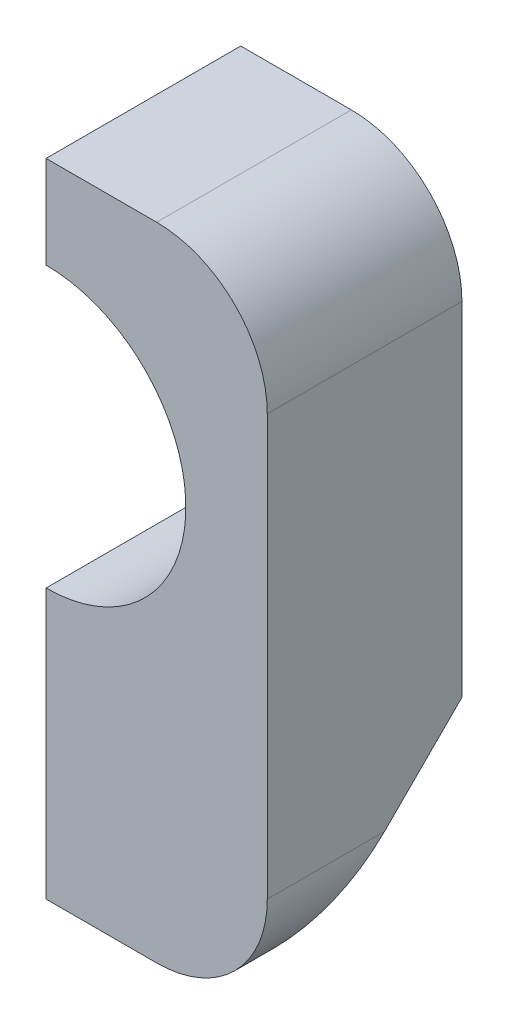
ISO-10303-21;
HEADER;
FILE_DESCRIPTION(('STEP AP214'),'2;1');
FILE_NAME('part.step','',(''),(''),'','','');
FILE_SCHEMA(('AUTOMOTIVE_DESIGN { 1 0 10303 214 1 1 1 1 }'));
ENDSEC;
DATA;
#1=APPLICATION_CONTEXT('core data for automotive mechanical design processes');
#2=APPLICATION_PROTOCOL_DEFINITION('international standard','automotive_design',2000,#1);
#3=PRODUCT_CONTEXT('',#1,'mechanical');
#4=PRODUCT('Part','Part','',(#3));
#5=PRODUCT_RELATED_PRODUCT_CATEGORY('part','',(#4));
#6=PRODUCT_DEFINITION_FORMATION('','',#4);
#7=PRODUCT_DEFINITION_CONTEXT('part definition',#1,'design');
#8=PRODUCT_DEFINITION('design','',#6,#7);
#9=PRODUCT_DEFINITION_SHAPE('','',#8);
#10=(LENGTH_UNIT() NAMED_UNIT(*) SI_UNIT(.MILLI.,.METRE.));
#11=(NAMED_UNIT(*) PLANE_ANGLE_UNIT() SI_UNIT($,.RADIAN.));
#12=(NAMED_UNIT(*) SI_UNIT($,.STERADIAN.) SOLID_ANGLE_UNIT());
#13=UNCERTAINTY_MEASURE_WITH_UNIT(LENGTH_MEASURE(1.E-05),#10,'distance_accuracy_value','');
#14=(GEOMETRIC_REPRESENTATION_CONTEXT(3) GLOBAL_UNCERTAINTY_ASSIGNED_CONTEXT((#13)) GLOBAL_UNIT_ASSIGNED_CONTEXT((#10,
#11,#12)) REPRESENTATION_CONTEXT('',''));
#15=CARTESIAN_POINT('',(0.,0.,0.));
#16=DIRECTION('',(0.,0.,1.));
#17=DIRECTION('',(1.,0.,0.));
#18=AXIS2_PLACEMENT_3D('',#15,#16,#17);
#19=CARTESIAN_POINT('',(0.,0.,0.));
#20=DIRECTION('',(-1.,0.,0.));
#21=DIRECTION('',(0.,0.,1.));
#22=AXIS2_PLACEMENT_3D('',#19,#20,#21);
#23=PLANE('',#22);
#24=DIRECTION('',(0.,-1.,0.));
#25=VECTOR('',#24,1.);
#26=CARTESIAN_POINT('',(0.,0.,13.97));
#27=LINE('',#26,#25);
#28=CARTESIAN_POINT('',(0.,16.66875,13.97));
#29=VERTEX_POINT('',#28);
#30=CARTESIAN_POINT('',(0.,10.033,13.97));
#31=VERTEX_POINT('',#30);
#32=EDGE_CURVE('E13',#29,#31,#27,.T.);
#33=ORIENTED_EDGE('',*,*,#32,.F.);
#34=DIRECTION('',(0.,0.,-1.));
#35=VECTOR('',#34,1.);
#36=CARTESIAN_POINT('',(0.,16.66875,76.99375));
#37=LINE('',#36,#35);
#38=CARTESIAN_POINT('',(0.,16.66875,0.));
#39=VERTEX_POINT('',#38);
#40=EDGE_CURVE('E176',#29,#39,#37,.T.);
#41=ORIENTED_EDGE('',*,*,#40,.T.);
#42=DIRECTION('',(0.,-1.,0.));
#43=VECTOR('',#42,1.);
#44=CARTESIAN_POINT('',(0.,16.66875,0.));
#45=LINE('',#44,#43);
#46=CARTESIAN_POINT('',(0.,12.7,0.));
#47=VERTEX_POINT('',#46);
#48=EDGE_CURVE('E173',#39,#47,#45,.T.);
#49=ORIENTED_EDGE('',*,*,#48,.T.);
#50=DIRECTION('',(0.,0.,1.));
#51=VECTOR('',#50,1.);
#52=CARTESIAN_POINT('',(0.,12.7,0.));
#53=LINE('',#52,#51);
#54=CARTESIAN_POINT('',(0.,12.7,0.79375));
#55=VERTEX_POINT('',#54);
#56=EDGE_CURVE('E185',#55,#47,#53,.F.);
#57=ORIENTED_EDGE('',*,*,#56,.F.);
#58=DIRECTION('',(0.,-1.,0.));
#59=VECTOR('',#58,1.);
#60=CARTESIAN_POINT('',(0.,12.827,0.79375));
#61=LINE('',#60,#59);
#62=CARTESIAN_POINT('',(0.,12.827,0.79375));
#63=VERTEX_POINT('',#62);
#64=EDGE_CURVE('E182',#63,#55,#61,.T.);
#65=ORIENTED_EDGE('',*,*,#64,.F.);
#66=CARTESIAN_POINT('',(0.,12.827,1.5875));
#67=DIRECTION('',(-1.,0.,0.));
#68=DIRECTION('',(0.,0.,1.));
#69=AXIS2_PLACEMENT_3D('',#66,#67,#68);
#70=CIRCLE('',#69,0.79375);
#71=CARTESIAN_POINT('',(0.,12.827,2.38125));
#72=VERTEX_POINT('',#71);
#73=EDGE_CURVE('E195',#72,#63,#70,.T.);
#74=ORIENTED_EDGE('',*,*,#73,.F.);
#75=DIRECTION('',(0.,1.,0.));
#76=VECTOR('',#75,1.);
#77=CARTESIAN_POINT('',(0.,12.827,2.38125));
#78=LINE('',#77,#76);
#79=CARTESIAN_POINT('',(0.,12.7,2.38125));
#80=VERTEX_POINT('',#79);
#81=EDGE_CURVE('E191',#80,#72,#78,.T.);
#82=ORIENTED_EDGE('',*,*,#81,.F.);
#83=DIRECTION('',(0.,0.,1.));
#84=VECTOR('',#83,1.);
#85=CARTESIAN_POINT('',(0.,12.7,0.));
#86=LINE('',#85,#84);
#87=CARTESIAN_POINT('',(0.,12.7,3.18135));
#88=VERTEX_POINT('',#87);
#89=EDGE_CURVE('E204',#88,#80,#86,.F.);
#90=ORIENTED_EDGE('',*,*,#89,.F.);
#91=DIRECTION('',(0.,1.,0.));
#92=VECTOR('',#91,1.);
#93=CARTESIAN_POINT('',(0.,12.7,3.18135));
#94=LINE('',#93,#92);
#95=CARTESIAN_POINT('',(0.,10.033,3.18135));
#96=VERTEX_POINT('',#95);
#97=EDGE_CURVE('E201',#96,#88,#94,.T.);
#98=ORIENTED_EDGE('',*,*,#97,.F.);
#99=DIRECTION('',(0.,0.,1.));
#100=VECTOR('',#99,1.);
#101=CARTESIAN_POINT('',(0.,10.033,0.));
#102=LINE('',#101,#100);
#103=EDGE_CURVE('E207',#31,#96,#102,.F.);
#104=ORIENTED_EDGE('',*,*,#103,.F.);
#105=EDGE_LOOP('',(#33,#41,#49,#57,#65,#74,#82,#90,#98,#104));
#106=FACE_BOUND('',#105,.T.);
#107=ADVANCED_FACE('F41',(#106),#23,.T.);
#108=CARTESIAN_POINT('',(15.875,16.66875,76.99375));
#109=DIRECTION('',(0.,-1.,0.));
#110=DIRECTION('',(0.,0.,-1.));
#111=AXIS2_PLACEMENT_3D('',#108,#109,#110);
#112=PLANE('',#111);
#113=ORIENTED_EDGE('',*,*,#40,.F.);
#114=DIRECTION('',(1.,0.,0.));
#115=VECTOR('',#114,1.);
#116=CARTESIAN_POINT('',(15.875,16.66875,13.97));
#117=LINE('',#116,#115);
#118=CARTESIAN_POINT('',(7.9375,16.66875,13.97));
#119=VERTEX_POINT('',#118);
#120=EDGE_CURVE('E167',#29,#119,#117,.T.);
#121=ORIENTED_EDGE('',*,*,#120,.T.);
#122=DIRECTION('',(0.,0.,-1.));
#123=VECTOR('',#122,1.);
#124=CARTESIAN_POINT('',(7.9375,16.66875,150.09495));
#125=LINE('',#124,#123);
#126=CARTESIAN_POINT('',(7.9375,16.66875,0.));
#127=VERTEX_POINT('',#126);
#128=EDGE_CURVE('E212',#119,#127,#125,.T.);
#129=ORIENTED_EDGE('',*,*,#128,.T.);
#130=DIRECTION('',(-1.,0.,0.));
#131=VECTOR('',#130,1.);
#132=CARTESIAN_POINT('',(15.875,16.66875,0.));
#133=LINE('',#132,#131);
#134=EDGE_CURVE('E250',#127,#39,#133,.T.);
#135=ORIENTED_EDGE('',*,*,#134,.T.);
#136=EDGE_LOOP('',(#113,#121,#129,#135));
#137=FACE_BOUND('',#136,.T.);
#138=ADVANCED_FACE('F271',(#137),#112,.F.);
#139=CARTESIAN_POINT('',(15.875,-29.36875,76.99375));
#140=DIRECTION('',(0.,1.,0.));
#141=DIRECTION('',(0.,0.,1.));
#142=AXIS2_PLACEMENT_3D('',#139,#140,#141);
#143=PLANE('',#142);
#144=DIRECTION('',(0.,0.,-1.));
#145=VECTOR('',#144,1.);
#146=CARTESIAN_POINT('',(7.9375,-29.36875,150.09495));
#147=LINE('',#146,#145);
#148=CARTESIAN_POINT('',(7.93750000000001,-29.36875,13.97));
#149=VERTEX_POINT('',#148);
#150=CARTESIAN_POINT('',(7.93750000000001,-29.36875,13.4937499999998));
#151=VERTEX_POINT('',#150);
#152=EDGE_CURVE('E63',#149,#151,#147,.T.);
#153=ORIENTED_EDGE('',*,*,#152,.F.);
#154=DIRECTION('',(-1.,0.,0.));
#155=VECTOR('',#154,1.);
#156=CARTESIAN_POINT('',(15.875,-29.36875,13.97));
#157=LINE('',#156,#155);
#158=CARTESIAN_POINT('',(0.,-29.36875,13.97));
#159=VERTEX_POINT('',#158);
#160=EDGE_CURVE('E148',#149,#159,#157,.T.);
#161=ORIENTED_EDGE('',*,*,#160,.T.);
#162=DIRECTION('',(0.,0.,1.));
#163=VECTOR('',#162,1.);
#164=CARTESIAN_POINT('',(0.,-29.36875,76.99375));
#165=LINE('',#164,#163);
#166=CARTESIAN_POINT('',(0.,-29.36875,13.4937499999998));
#167=VERTEX_POINT('',#166);
#168=EDGE_CURVE('E155',#167,#159,#165,.T.);
#169=ORIENTED_EDGE('',*,*,#168,.F.);
#170=DIRECTION('',(1.,0.,0.));
#171=VECTOR('',#170,1.);
#172=CARTESIAN_POINT('',(-15.875,-29.36875,13.4937499999999));
#173=LINE('',#172,#171);
#174=EDGE_CURVE('E223',#167,#151,#173,.T.);
#175=ORIENTED_EDGE('',*,*,#174,.T.);
#176=EDGE_LOOP('',(#153,#161,#169,#175));
#177=FACE_BOUND('',#176,.T.);
#178=ADVANCED_FACE('F43',(#177),#143,.F.);
#179=CARTESIAN_POINT('',(15.875,16.66875,0.));
#180=DIRECTION('',(0.,0.,1.));
#181=DIRECTION('',(1.,0.,0.));
#182=AXIS2_PLACEMENT_3D('',#179,#180,#181);
#183=PLANE('',#182);
#184=ORIENTED_EDGE('',*,*,#48,.F.);
#185=ORIENTED_EDGE('',*,*,#134,.F.);
#186=CARTESIAN_POINT('',(7.9375,8.73125,0.));
#187=DIRECTION('',(0.,0.,1.));
#188=DIRECTION('',(-1.,0.,0.));
#189=AXIS2_PLACEMENT_3D('',#186,#187,#188);
#190=CIRCLE('',#189,7.9375);
#191=CARTESIAN_POINT('',(15.875,8.73125,0.));
#192=VERTEX_POINT('',#191);
#193=EDGE_CURVE('E209',#192,#127,#190,.T.);
#194=ORIENTED_EDGE('',*,*,#193,.F.);
#195=DIRECTION('',(0.,1.,0.));
#196=VECTOR('',#195,1.);
#197=CARTESIAN_POINT('',(15.875,16.66875,0.));
#198=LINE('',#197,#196);
#199=CARTESIAN_POINT('',(15.875,-15.875,0.));
#200=VERTEX_POINT('',#199);
#201=EDGE_CURVE('E247',#200,#192,#198,.T.);
#202=ORIENTED_EDGE('',*,*,#201,.F.);
#203=DIRECTION('',(1.,0.,0.));
#204=VECTOR('',#203,1.);
#205=CARTESIAN_POINT('',(-15.875,-15.875,0.));
#206=LINE('',#205,#204);
#207=CARTESIAN_POINT('',(0.,-15.875,0.));
#208=VERTEX_POINT('',#207);
#209=EDGE_CURVE('E222',#208,#200,#206,.T.);
#210=ORIENTED_EDGE('',*,*,#209,.F.);
#211=CARTESIAN_POINT('',(0.,-12.7,0.));
#212=VERTEX_POINT('',#211);
#213=EDGE_CURVE('E164',#212,#208,#45,.T.);
#214=ORIENTED_EDGE('',*,*,#213,.F.);
#215=CARTESIAN_POINT('',(0.,0.,0.));
#216=DIRECTION('',(0.,0.,1.));
#217=DIRECTION('',(1.,0.,0.));
#218=AXIS2_PLACEMENT_3D('',#215,#216,#217);
#219=CIRCLE('',#218,12.7);
#220=EDGE_CURVE('E235',#212,#47,#219,.T.);
#221=ORIENTED_EDGE('',*,*,#220,.T.);
#222=EDGE_LOOP('',(#184,#185,#194,#202,#210,#214,#221));
#223=FACE_BOUND('',#222,.T.);
#224=ADVANCED_FACE('F279',(#223),#183,.F.);
#225=CARTESIAN_POINT('',(0.,0.,1.5875));
#226=DIRECTION('',(0.,0.,1.));
#227=DIRECTION('',(1.,0.,0.));
#228=AXIS2_PLACEMENT_3D('',#225,#226,#227);
#229=TOROIDAL_SURFACE('',#228,12.827,0.79375);
#230=CARTESIAN_POINT('',(0.,0.,0.79375));
#231=DIRECTION('',(0.,0.,1.));
#232=DIRECTION('',(1.,0.,0.));
#233=AXIS2_PLACEMENT_3D('',#230,#231,#232);
#234=CIRCLE('',#233,12.827);
#235=CARTESIAN_POINT('',(0.,-12.827,0.79375));
#236=VERTEX_POINT('',#235);
#237=EDGE_CURVE('E229',#236,#63,#234,.T.);
#238=ORIENTED_EDGE('',*,*,#237,.F.);
#239=CARTESIAN_POINT('',(0.,-12.827,1.5875));
#240=DIRECTION('',(-1.,0.,0.));
#241=DIRECTION('',(0.,0.,1.));
#242=AXIS2_PLACEMENT_3D('',#239,#240,#241);
#243=CIRCLE('',#242,0.79375);
#244=CARTESIAN_POINT('',(0.,-12.827,2.38125));
#245=VERTEX_POINT('',#244);
#246=EDGE_CURVE('E181',#236,#245,#243,.T.);
#247=ORIENTED_EDGE('',*,*,#246,.T.);
#248=CARTESIAN_POINT('',(0.,0.,2.38125));
#249=DIRECTION('',(0.,0.,1.));
#250=DIRECTION('',(1.,0.,0.));
#251=AXIS2_PLACEMENT_3D('',#248,#249,#250);
#252=CIRCLE('',#251,12.827);
#253=EDGE_CURVE('E244',#245,#72,#252,.T.);
#254=ORIENTED_EDGE('',*,*,#253,.T.);
#255=ORIENTED_EDGE('',*,*,#73,.T.);
#256=EDGE_LOOP('',(#238,#247,#254,#255));
#257=FACE_BOUND('',#256,.T.);
#258=ADVANCED_FACE('F292',(#257),#229,.F.);
#259=CARTESIAN_POINT('',(0.,12.827,2.38125));
#260=DIRECTION('',(0.,0.,-1.));
#261=DIRECTION('',(-1.,0.,0.));
#262=AXIS2_PLACEMENT_3D('',#259,#260,#261);
#263=PLANE('',#262);
#264=ORIENTED_EDGE('',*,*,#253,.F.);
#265=CARTESIAN_POINT('',(0.,-12.7,2.38125));
#266=VERTEX_POINT('',#265);
#267=EDGE_CURVE('E188',#245,#266,#78,.T.);
#268=ORIENTED_EDGE('',*,*,#267,.T.);
#269=CARTESIAN_POINT('',(0.,0.,2.38125));
#270=DIRECTION('',(0.,0.,1.));
#271=DIRECTION('',(1.,0.,0.));
#272=AXIS2_PLACEMENT_3D('',#269,#270,#271);
#273=CIRCLE('',#272,12.7);
#274=EDGE_CURVE('E241',#266,#80,#273,.T.);
#275=ORIENTED_EDGE('',*,*,#274,.T.);
#276=ORIENTED_EDGE('',*,*,#81,.T.);
#277=EDGE_LOOP('',(#264,#268,#275,#276));
#278=FACE_BOUND('',#277,.T.);
#279=ADVANCED_FACE('F295',(#278),#263,.T.);
#280=CARTESIAN_POINT('',(0.,0.,0.));
#281=DIRECTION('',(0.,0.,1.));
#282=DIRECTION('',(1.,0.,0.));
#283=AXIS2_PLACEMENT_3D('',#280,#281,#282);
#284=CYLINDRICAL_SURFACE('',#283,12.7);
#285=ORIENTED_EDGE('',*,*,#274,.F.);
#286=DIRECTION('',(0.,0.,1.));
#287=VECTOR('',#286,1.);
#288=CARTESIAN_POINT('',(0.,-12.7,0.));
#289=LINE('',#288,#287);
#290=CARTESIAN_POINT('',(0.,-12.7,3.18135));
#291=VERTEX_POINT('',#290);
#292=EDGE_CURVE('E192',#266,#291,#289,.T.);
#293=ORIENTED_EDGE('',*,*,#292,.T.);
#294=CARTESIAN_POINT('',(0.,0.,3.18135));
#295=DIRECTION('',(0.,0.,1.));
#296=DIRECTION('',(1.,0.,0.));
#297=AXIS2_PLACEMENT_3D('',#294,#295,#296);
#298=CIRCLE('',#297,12.7);
#299=EDGE_CURVE('E238',#291,#88,#298,.T.);
#300=ORIENTED_EDGE('',*,*,#299,.T.);
#301=ORIENTED_EDGE('',*,*,#89,.T.);
#302=EDGE_LOOP('',(#285,#293,#300,#301));
#303=FACE_BOUND('',#302,.T.);
#304=ADVANCED_FACE('F300',(#303),#284,.F.);
#305=CARTESIAN_POINT('',(0.,12.7,3.18135));
#306=DIRECTION('',(0.,0.,-1.));
#307=DIRECTION('',(-1.,0.,0.));
#308=AXIS2_PLACEMENT_3D('',#305,#306,#307);
#309=PLANE('',#308);
#310=ORIENTED_EDGE('',*,*,#299,.F.);
#311=CARTESIAN_POINT('',(0.,-10.033,3.18135));
#312=VERTEX_POINT('',#311);
#313=EDGE_CURVE('E198',#291,#312,#94,.T.);
#314=ORIENTED_EDGE('',*,*,#313,.T.);
#315=CARTESIAN_POINT('',(0.,0.,3.18135));
#316=DIRECTION('',(0.,0.,1.));
#317=DIRECTION('',(1.,0.,0.));
#318=AXIS2_PLACEMENT_3D('',#315,#316,#317);
#319=CIRCLE('',#318,10.033);
#320=EDGE_CURVE('E225',#312,#96,#319,.T.);
#321=ORIENTED_EDGE('',*,*,#320,.T.);
#322=ORIENTED_EDGE('',*,*,#97,.T.);
#323=EDGE_LOOP('',(#310,#314,#321,#322));
#324=FACE_BOUND('',#323,.T.);
#325=ADVANCED_FACE('F303',(#324),#309,.T.);
#326=CARTESIAN_POINT('',(0.,0.,0.));
#327=DIRECTION('',(0.,0.,1.));
#328=DIRECTION('',(1.,0.,0.));
#329=AXIS2_PLACEMENT_3D('',#326,#327,#328);
#330=CYLINDRICAL_SURFACE('',#329,12.7);
#331=ORIENTED_EDGE('',*,*,#220,.F.);
#332=DIRECTION('',(0.,0.,1.));
#333=VECTOR('',#332,1.);
#334=CARTESIAN_POINT('',(0.,-12.7,0.));
#335=LINE('',#334,#333);
#336=CARTESIAN_POINT('',(0.,-12.7,0.79375));
#337=VERTEX_POINT('',#336);
#338=EDGE_CURVE('E172',#212,#337,#335,.T.);
#339=ORIENTED_EDGE('',*,*,#338,.T.);
#340=CARTESIAN_POINT('',(0.,0.,0.79375));
#341=DIRECTION('',(0.,0.,1.));
#342=DIRECTION('',(1.,0.,0.));
#343=AXIS2_PLACEMENT_3D('',#340,#341,#342);
#344=CIRCLE('',#343,12.7);
#345=EDGE_CURVE('E232',#337,#55,#344,.T.);
#346=ORIENTED_EDGE('',*,*,#345,.T.);
#347=ORIENTED_EDGE('',*,*,#56,.T.);
#348=EDGE_LOOP('',(#331,#339,#346,#347));
#349=FACE_BOUND('',#348,.T.);
#350=ADVANCED_FACE('F285',(#349),#330,.F.);
#351=CARTESIAN_POINT('',(0.,12.827,0.79375));
#352=DIRECTION('',(0.,0.,1.));
#353=DIRECTION('',(1.,0.,0.));
#354=AXIS2_PLACEMENT_3D('',#351,#352,#353);
#355=PLANE('',#354);
#356=ORIENTED_EDGE('',*,*,#237,.T.);
#357=ORIENTED_EDGE('',*,*,#64,.T.);
#358=ORIENTED_EDGE('',*,*,#345,.F.);
#359=EDGE_CURVE('E178',#337,#236,#61,.T.);
#360=ORIENTED_EDGE('',*,*,#359,.T.);
#361=EDGE_LOOP('',(#356,#357,#358,#360));
#362=FACE_BOUND('',#361,.T.);
#363=ADVANCED_FACE('F288',(#362),#355,.T.);
#364=CARTESIAN_POINT('',(0.,0.,0.));
#365=DIRECTION('',(0.,0.,1.));
#366=DIRECTION('',(1.,0.,0.));
#367=AXIS2_PLACEMENT_3D('',#364,#365,#366);
#368=CYLINDRICAL_SURFACE('',#367,10.033);
#369=CARTESIAN_POINT('',(0.,0.,13.97));
#370=DIRECTION('',(0.,0.,-1.));
#371=DIRECTION('',(-1.,0.,0.));
#372=AXIS2_PLACEMENT_3D('',#369,#370,#371);
#373=CIRCLE('',#372,10.033);
#374=CARTESIAN_POINT('',(0.,-10.033,13.97));
#375=VERTEX_POINT('',#374);
#376=EDGE_CURVE('E55',#31,#375,#373,.T.);
#377=ORIENTED_EDGE('',*,*,#376,.F.);
#378=ORIENTED_EDGE('',*,*,#103,.T.);
#379=ORIENTED_EDGE('',*,*,#320,.F.);
#380=DIRECTION('',(0.,0.,1.));
#381=VECTOR('',#380,1.);
#382=CARTESIAN_POINT('',(0.,-10.033,0.));
#383=LINE('',#382,#381);
#384=EDGE_CURVE('E202',#312,#375,#383,.T.);
#385=ORIENTED_EDGE('',*,*,#384,.T.);
#386=EDGE_LOOP('',(#377,#378,#379,#385));
#387=FACE_BOUND('',#386,.T.);
#388=ADVANCED_FACE('F307',(#387),#368,.F.);
#389=CARTESIAN_POINT('',(-15.875,-15.875,0.));
#390=DIRECTION('',(0.,0.707106781186544,0.707106781186551));
#391=DIRECTION('',(0.,-0.707106781186551,0.707106781186544));
#392=AXIS2_PLACEMENT_3D('',#389,#390,#391);
#393=PLANE('',#392);
#394=DIRECTION('',(0.,-0.707106781186551,0.707106781186544));
#395=VECTOR('',#394,1.);
#396=CARTESIAN_POINT('',(0.,-15.875,0.));
#397=LINE('',#396,#395);
#398=EDGE_CURVE('E161',#208,#167,#397,.T.);
#399=ORIENTED_EDGE('',*,*,#398,.F.);
#400=ORIENTED_EDGE('',*,*,#209,.T.);
#401=DIRECTION('',(0.,-0.707106781186551,0.707106781186544));
#402=VECTOR('',#401,1.);
#403=CARTESIAN_POINT('',(15.875,-15.875,0.));
#404=LINE('',#403,#402);
#405=CARTESIAN_POINT('',(15.875,-21.43125,5.55624999999999));
#406=VERTEX_POINT('',#405);
#407=EDGE_CURVE('E219',#200,#406,#404,.T.);
#408=ORIENTED_EDGE('',*,*,#407,.T.);
#409=CARTESIAN_POINT('',(7.93750000000001,-21.43125,5.55624999999993));
#410=DIRECTION('',(0.,0.707106781186544,0.707106781186551));
#411=DIRECTION('',(0.,0.707106781186551,-0.707106781186544));
#412=AXIS2_PLACEMENT_3D('',#409,#410,#411);
#413=ELLIPSE('',#412,11.2253201513364,7.9375);
#414=EDGE_CURVE('E152',#406,#151,#413,.F.);
#415=ORIENTED_EDGE('',*,*,#414,.T.);
#416=ORIENTED_EDGE('',*,*,#174,.F.);
#417=EDGE_LOOP('',(#399,#400,#408,#415,#416));
#418=FACE_BOUND('',#417,.T.);
#419=ADVANCED_FACE('F254',(#418),#393,.F.);
#420=CARTESIAN_POINT('',(15.875,0.,0.));
#421=DIRECTION('',(1.,0.,0.));
#422=DIRECTION('',(0.,0.,-1.));
#423=AXIS2_PLACEMENT_3D('',#420,#421,#422);
#424=PLANE('',#423);
#425=DIRECTION('',(0.,1.,0.));
#426=VECTOR('',#425,1.);
#427=CARTESIAN_POINT('',(15.875,0.,13.97));
#428=LINE('',#427,#426);
#429=CARTESIAN_POINT('',(15.875,-21.43125,13.97));
#430=VERTEX_POINT('',#429);
#431=CARTESIAN_POINT('',(15.875,8.73125,13.97));
#432=VERTEX_POINT('',#431);
#433=EDGE_CURVE('E263',#430,#432,#428,.T.);
#434=ORIENTED_EDGE('',*,*,#433,.F.);
#435=DIRECTION('',(0.,0.,-1.));
#436=VECTOR('',#435,1.);
#437=CARTESIAN_POINT('',(15.875,-21.43125,150.09495));
#438=LINE('',#437,#436);
#439=EDGE_CURVE('E216',#430,#406,#438,.T.);
#440=ORIENTED_EDGE('',*,*,#439,.T.);
#441=ORIENTED_EDGE('',*,*,#407,.F.);
#442=ORIENTED_EDGE('',*,*,#201,.T.);
#443=DIRECTION('',(0.,0.,-1.));
#444=VECTOR('',#443,1.);
#445=CARTESIAN_POINT('',(15.875,8.73125,150.09495));
#446=LINE('',#445,#444);
#447=EDGE_CURVE('E214',#432,#192,#446,.T.);
#448=ORIENTED_EDGE('',*,*,#447,.F.);
#449=EDGE_LOOP('',(#434,#440,#441,#442,#448));
#450=FACE_BOUND('',#449,.T.);
#451=ADVANCED_FACE('F260',(#450),#424,.T.);
#452=CARTESIAN_POINT('',(7.93750000000001,-21.43125,150.09495));
#453=DIRECTION('',(0.,0.,-1.));
#454=DIRECTION('',(-1.,0.,0.));
#455=AXIS2_PLACEMENT_3D('',#452,#453,#454);
#456=CYLINDRICAL_SURFACE('',#455,7.9375);
#457=ORIENTED_EDGE('',*,*,#439,.F.);
#458=CARTESIAN_POINT('',(7.93750000000001,-21.43125,13.97));
#459=DIRECTION('',(0.,0.,-1.));
#460=DIRECTION('',(-1.,0.,0.));
#461=AXIS2_PLACEMENT_3D('',#458,#459,#460);
#462=CIRCLE('',#461,7.9375);
#463=EDGE_CURVE('E157',#430,#149,#462,.T.);
#464=ORIENTED_EDGE('',*,*,#463,.T.);
#465=ORIENTED_EDGE('',*,*,#152,.T.);
#466=ORIENTED_EDGE('',*,*,#414,.F.);
#467=EDGE_LOOP('',(#457,#464,#465,#466));
#468=FACE_BOUND('',#467,.T.);
#469=ADVANCED_FACE('F257',(#468),#456,.T.);
#470=CARTESIAN_POINT('',(7.9375,8.73125,150.09495));
#471=DIRECTION('',(0.,0.,-1.));
#472=DIRECTION('',(-1.,0.,0.));
#473=AXIS2_PLACEMENT_3D('',#470,#471,#472);
#474=CYLINDRICAL_SURFACE('',#473,7.9375);
#475=ORIENTED_EDGE('',*,*,#128,.F.);
#476=CARTESIAN_POINT('',(7.9375,8.73125,13.97));
#477=DIRECTION('',(0.,0.,-1.));
#478=DIRECTION('',(-1.,0.,0.));
#479=AXIS2_PLACEMENT_3D('',#476,#477,#478);
#480=CIRCLE('',#479,7.9375);
#481=EDGE_CURVE('E162',#119,#432,#480,.T.);
#482=ORIENTED_EDGE('',*,*,#481,.T.);
#483=ORIENTED_EDGE('',*,*,#447,.T.);
#484=ORIENTED_EDGE('',*,*,#193,.T.);
#485=EDGE_LOOP('',(#475,#482,#483,#484));
#486=FACE_BOUND('',#485,.T.);
#487=ADVANCED_FACE('F274',(#486),#474,.T.);
#488=EDGE_CURVE('E45',#375,#159,#27,.T.);
#489=ORIENTED_EDGE('',*,*,#488,.F.);
#490=ORIENTED_EDGE('',*,*,#384,.F.);
#491=ORIENTED_EDGE('',*,*,#313,.F.);
#492=ORIENTED_EDGE('',*,*,#292,.F.);
#493=ORIENTED_EDGE('',*,*,#267,.F.);
#494=ORIENTED_EDGE('',*,*,#246,.F.);
#495=ORIENTED_EDGE('',*,*,#359,.F.);
#496=ORIENTED_EDGE('',*,*,#338,.F.);
#497=ORIENTED_EDGE('',*,*,#213,.T.);
#498=ORIENTED_EDGE('',*,*,#398,.T.);
#499=ORIENTED_EDGE('',*,*,#168,.T.);
#500=EDGE_LOOP('',(#489,#490,#491,#492,#493,#494,#495,#496,#497,#498,#499));
#501=FACE_BOUND('',#500,.T.);
#502=ADVANCED_FACE('F159',(#501),#23,.T.);
#503=CARTESIAN_POINT('',(0.,0.,13.97));
#504=DIRECTION('',(0.,0.,-1.));
#505=DIRECTION('',(-1.,0.,0.));
#506=AXIS2_PLACEMENT_3D('',#503,#504,#505);
#507=PLANE('',#506);
#508=ORIENTED_EDGE('',*,*,#120,.F.);
#509=ORIENTED_EDGE('',*,*,#32,.T.);
#510=ORIENTED_EDGE('',*,*,#376,.T.);
#511=ORIENTED_EDGE('',*,*,#488,.T.);
#512=ORIENTED_EDGE('',*,*,#160,.F.);
#513=ORIENTED_EDGE('',*,*,#463,.F.);
#514=ORIENTED_EDGE('',*,*,#433,.T.);
#515=ORIENTED_EDGE('',*,*,#481,.F.);
#516=EDGE_LOOP('',(#508,#509,#510,#511,#512,#513,#514,#515));
#517=FACE_BOUND('',#516,.T.);
#518=ADVANCED_FACE('F147',(#517),#507,.F.);
#519=CLOSED_SHELL('',(#107,#138,#178,#224,#258,#279,#304,#325,#350,#363,#388,#419,#451,#469,
#487,#502,#518));
#520=MANIFOLD_SOLID_BREP('B2',#519);
#521=ADVANCED_BREP_SHAPE_REPRESENTATION('',(#18,#520),#14);
#522=SHAPE_DEFINITION_REPRESENTATION(#9,#521);
ENDSEC;
END-ISO-10303-21;
